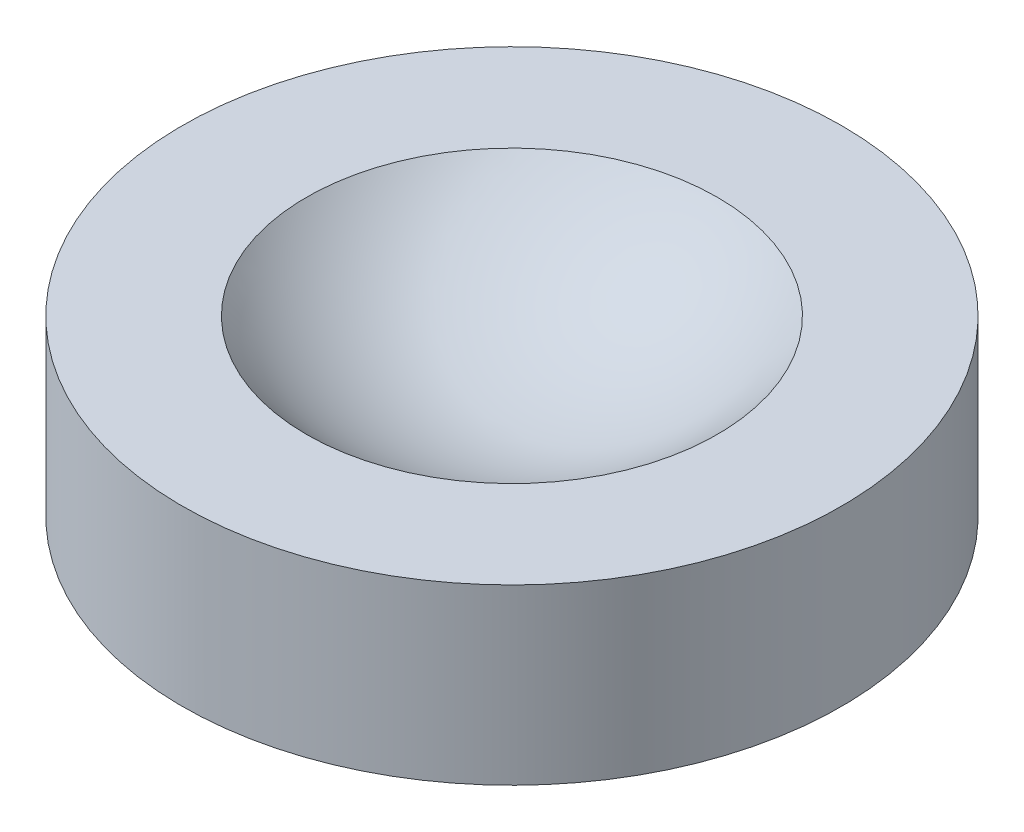
ISO-10303-21;
HEADER;
FILE_DESCRIPTION(('STEP AP214'),'2;1');
FILE_NAME('part.step','',(''),(''),'','','');
FILE_SCHEMA(('AUTOMOTIVE_DESIGN { 1 0 10303 214 1 1 1 1 }'));
ENDSEC;
DATA;
#1=APPLICATION_CONTEXT('core data for automotive mechanical design processes');
#2=APPLICATION_PROTOCOL_DEFINITION('international standard','automotive_design',2000,#1);
#3=PRODUCT_CONTEXT('',#1,'mechanical');
#4=PRODUCT('Part','Part','',(#3));
#5=PRODUCT_RELATED_PRODUCT_CATEGORY('part','',(#4));
#6=PRODUCT_DEFINITION_FORMATION('','',#4);
#7=PRODUCT_DEFINITION_CONTEXT('part definition',#1,'design');
#8=PRODUCT_DEFINITION('design','',#6,#7);
#9=PRODUCT_DEFINITION_SHAPE('','',#8);
#10=(LENGTH_UNIT() NAMED_UNIT(*) SI_UNIT(.MILLI.,.METRE.));
#11=(NAMED_UNIT(*) PLANE_ANGLE_UNIT() SI_UNIT($,.RADIAN.));
#12=(NAMED_UNIT(*) SI_UNIT($,.STERADIAN.) SOLID_ANGLE_UNIT());
#13=UNCERTAINTY_MEASURE_WITH_UNIT(LENGTH_MEASURE(1.E-05),#10,'distance_accuracy_value','');
#14=(GEOMETRIC_REPRESENTATION_CONTEXT(3) GLOBAL_UNCERTAINTY_ASSIGNED_CONTEXT((#13)) GLOBAL_UNIT_ASSIGNED_CONTEXT((#10,
#11,#12)) REPRESENTATION_CONTEXT('',''));
#15=CARTESIAN_POINT('',(0.,0.,0.));
#16=DIRECTION('',(0.,0.,1.));
#17=DIRECTION('',(1.,0.,0.));
#18=AXIS2_PLACEMENT_3D('',#15,#16,#17);
#19=CARTESIAN_POINT('',(-71.2916512459885,69.5,-25.9807621135332));
#20=DIRECTION('',(0.,-1.,0.));
#21=DIRECTION('',(0.,0.,1.));
#22=AXIS2_PLACEMENT_3D('',#19,#20,#21);
#23=CYLINDRICAL_SURFACE('',#22,3.8);
#24=CARTESIAN_POINT('',(-71.2916512459885,69.,-25.9807621135332));
#25=DIRECTION('',(0.,-1.,0.));
#26=DIRECTION('',(0.,0.,-1.));
#27=AXIS2_PLACEMENT_3D('',#24,#25,#26);
#28=CIRCLE('',#27,3.8);
#29=CARTESIAN_POINT('',(-70.7717502583161,69.,-29.7450287038555));
#30=VERTEX_POINT('',#29);
#31=CARTESIAN_POINT('',(-74.811552233661,69.,-27.4126479459174));
#32=VERTEX_POINT('',#31);
#33=EDGE_CURVE('E80',#30,#32,#28,.T.);
#34=ORIENTED_EDGE('',*,*,#33,.F.);
#35=DIRECTION('',(0.,-1.,0.));
#36=VECTOR('',#35,1.);
#37=CARTESIAN_POINT('',(-70.7717502583161,69.5,-29.7450287038555));
#38=LINE('',#37,#36);
#39=CARTESIAN_POINT('',(-70.7717502583161,69.5,-29.7450287038555));
#40=VERTEX_POINT('',#39);
#41=EDGE_CURVE('E49',#40,#30,#38,.T.);
#42=ORIENTED_EDGE('',*,*,#41,.F.);
#43=CARTESIAN_POINT('',(-71.2916512459885,69.5,-25.9807621135332));
#44=DIRECTION('',(0.,-1.,0.));
#45=DIRECTION('',(0.,0.,-1.));
#46=AXIS2_PLACEMENT_3D('',#43,#44,#45);
#47=CIRCLE('',#46,3.8);
#48=CARTESIAN_POINT('',(-74.811552233661,69.5,-27.4126479459174));
#49=VERTEX_POINT('',#48);
#50=EDGE_CURVE('E72',#49,#40,#47,.T.);
#51=ORIENTED_EDGE('',*,*,#50,.F.);
#52=DIRECTION('',(0.,-1.,0.));
#53=VECTOR('',#52,1.);
#54=CARTESIAN_POINT('',(-74.811552233661,69.5,-27.4126479459174));
#55=LINE('',#54,#53);
#56=EDGE_CURVE('E11',#49,#32,#55,.T.);
#57=ORIENTED_EDGE('',*,*,#56,.T.);
#58=EDGE_LOOP('',(#34,#42,#51,#57));
#59=FACE_BOUND('',#58,.T.);
#60=CARTESIAN_POINT('',(-71.2916512459885,71.,-25.9807621135332));
#61=DIRECTION('',(0.,-1.,0.));
#62=DIRECTION('',(0.,0.,-1.));
#63=AXIS2_PLACEMENT_3D('',#60,#61,#62);
#64=CIRCLE('',#63,3.8);
#65=CARTESIAN_POINT('',(-71.2916512459885,71.,-29.7807621135332));
#66=VERTEX_POINT('',#65);
#67=EDGE_CURVE('E74',#66,#66,#64,.T.);
#68=ORIENTED_EDGE('',*,*,#67,.T.);
#69=EDGE_LOOP('',(#68));
#70=FACE_BOUND('',#69,.T.);
#71=ADVANCED_FACE('F41',(#59,#70),#23,.T.);
#72=CARTESIAN_POINT('',(-74.811552233661,69.5,-27.4126479459174));
#73=DIRECTION('',(0.499999999999999,0.,0.86602540378444));
#74=DIRECTION('',(0.86602540378444,0.,-0.499999999999999));
#75=AXIS2_PLACEMENT_3D('',#72,#73,#74);
#76=PLANE('',#75);
#77=DIRECTION('',(0.86602540378444,0.,-0.499999999999999));
#78=VECTOR('',#77,1.);
#79=CARTESIAN_POINT('',(-74.811552233661,69.,-27.4126479459174));
#80=LINE('',#79,#78);
#81=EDGE_CURVE('E63',#32,#30,#80,.T.);
#82=ORIENTED_EDGE('',*,*,#81,.F.);
#83=ORIENTED_EDGE('',*,*,#56,.F.);
#84=DIRECTION('',(0.86602540378444,0.,-0.499999999999999));
#85=VECTOR('',#84,1.);
#86=CARTESIAN_POINT('',(-74.811552233661,69.5,-27.4126479459174));
#87=LINE('',#86,#85);
#88=EDGE_CURVE('E57',#49,#40,#87,.T.);
#89=ORIENTED_EDGE('',*,*,#88,.T.);
#90=ORIENTED_EDGE('',*,*,#41,.T.);
#91=EDGE_LOOP('',(#82,#83,#89,#90));
#92=FACE_BOUND('',#91,.T.);
#93=ADVANCED_FACE('F66',(#92),#76,.F.);
#94=CARTESIAN_POINT('',(-71.2916512459885,69.,-25.9807621135332));
#95=DIRECTION('',(0.,1.,0.));
#96=DIRECTION('',(0.,0.,-1.));
#97=AXIS2_PLACEMENT_3D('',#94,#95,#96);
#98=PLANE('',#97);
#99=ORIENTED_EDGE('',*,*,#33,.T.);
#100=ORIENTED_EDGE('',*,*,#81,.T.);
#101=EDGE_LOOP('',(#99,#100));
#102=FACE_BOUND('',#101,.T.);
#103=ADVANCED_FACE('F100',(#102),#98,.F.);
#104=CARTESIAN_POINT('',(-71.2916512459885,69.5,-25.9807621135332));
#105=DIRECTION('',(0.,1.,0.));
#106=DIRECTION('',(0.,0.,-1.));
#107=AXIS2_PLACEMENT_3D('',#104,#105,#106);
#108=PLANE('',#107);
#109=ORIENTED_EDGE('',*,*,#50,.T.);
#110=ORIENTED_EDGE('',*,*,#88,.F.);
#111=EDGE_LOOP('',(#109,#110));
#112=FACE_BOUND('',#111,.T.);
#113=ADVANCED_FACE('F75',(#112),#108,.F.);
#114=CARTESIAN_POINT('',(-71.2916512459885,71.,-25.9807621135332));
#115=DIRECTION('',(0.,1.,0.));
#116=DIRECTION('',(0.,0.,-1.));
#117=AXIS2_PLACEMENT_3D('',#114,#115,#116);
#118=PLANE('',#117);
#119=CARTESIAN_POINT('',(-71.2916512459885,71.,-25.9807621135332));
#120=DIRECTION('',(0.,-1.,0.));
#121=DIRECTION('',(0.,0.,-1.));
#122=AXIS2_PLACEMENT_3D('',#119,#120,#121);
#123=CIRCLE('',#122,2.36854385646542);
#124=CARTESIAN_POINT('',(-71.2916512459885,71.,-28.3493059699986));
#125=VERTEX_POINT('',#124);
#126=EDGE_CURVE('E42',#125,#125,#123,.T.);
#127=ORIENTED_EDGE('',*,*,#126,.T.);
#128=EDGE_LOOP('',(#127));
#129=FACE_BOUND('',#128,.T.);
#130=ORIENTED_EDGE('',*,*,#67,.F.);
#131=EDGE_LOOP('',(#130));
#132=FACE_BOUND('',#131,.T.);
#133=ADVANCED_FACE('F88',(#129,#132),#118,.T.);
#134=CARTESIAN_POINT('',(-71.2916512459885,73.,-25.9807621135332));
#135=DIRECTION('',(0.,0.,-1.));
#136=DIRECTION('',(-1.,0.,0.));
#137=AXIS2_PLACEMENT_3D('',#134,#135,#136);
#138=SPHERICAL_SURFACE('',#137,3.1);
#139=CARTESIAN_POINT('',(-71.2916512459885,73.,-25.9807621135332));
#140=DIRECTION('',(0.,-1.,0.));
#141=DIRECTION('',(0.,0.,-1.));
#142=AXIS2_PLACEMENT_3D('',#139,#140,#141);
#143=SPHERICAL_SURFACE('',#142,3.1);
#144=ORIENTED_EDGE('',*,*,#126,.F.);
#145=EDGE_LOOP('',(#144));
#146=FACE_BOUND('',#145,.T.);
#147=ADVANCED_FACE('F86',(#146),#143,.F.);
#148=CLOSED_SHELL('',(#71,#93,#103,#113,#133,#147));
#149=MANIFOLD_SOLID_BREP('B2',#148);
#150=ADVANCED_BREP_SHAPE_REPRESENTATION('',(#18,#149),#14);
#151=SHAPE_DEFINITION_REPRESENTATION(#9,#150);
ENDSEC;
END-ISO-10303-21;
